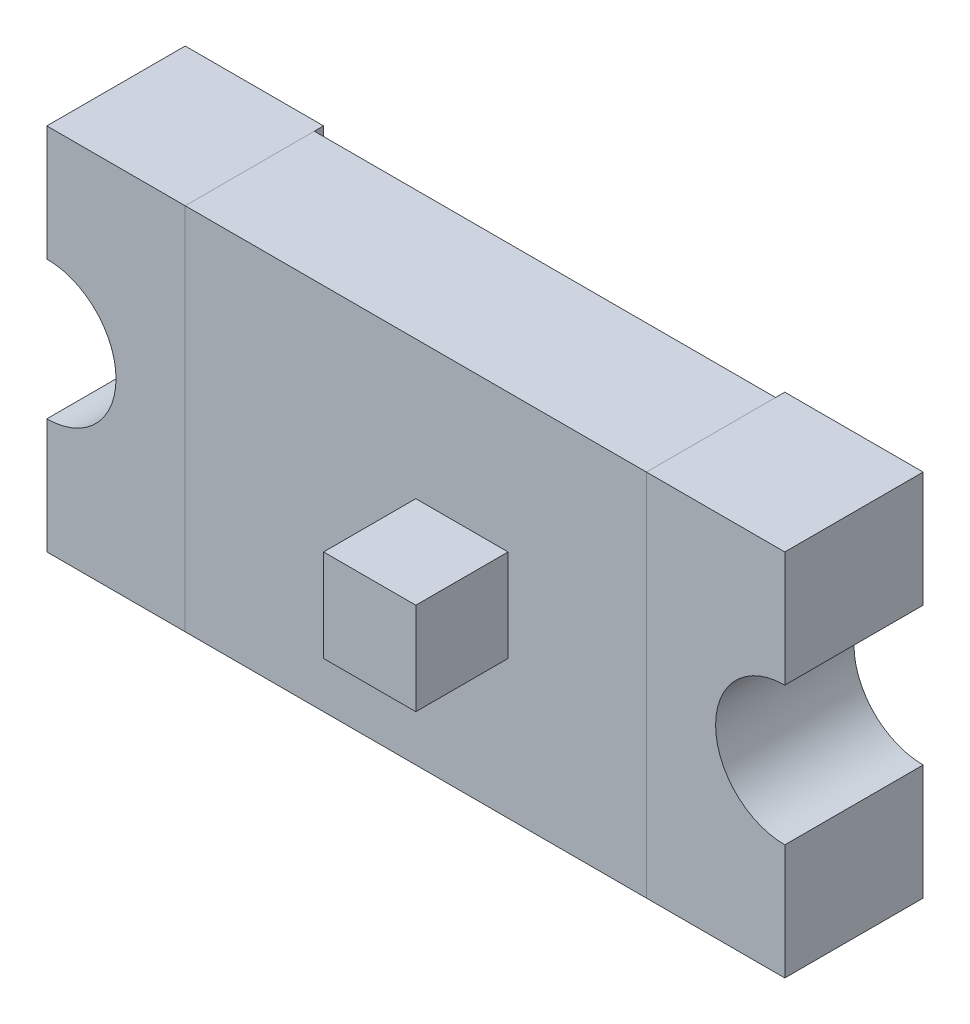
ISO-10303-21;
HEADER;
FILE_DESCRIPTION(('STEP AP214'),'2;1');
FILE_NAME('part.step','',(''),(''),'','','');
FILE_SCHEMA(('AUTOMOTIVE_DESIGN { 1 0 10303 214 1 1 1 1 }'));
ENDSEC;
DATA;
#1=APPLICATION_CONTEXT('core data for automotive mechanical design processes');
#2=APPLICATION_PROTOCOL_DEFINITION('international standard','automotive_design',2000,#1);
#3=PRODUCT_CONTEXT('',#1,'mechanical');
#4=PRODUCT('Part','Part','',(#3));
#5=PRODUCT_RELATED_PRODUCT_CATEGORY('part','',(#4));
#6=PRODUCT_DEFINITION_FORMATION('','',#4);
#7=PRODUCT_DEFINITION_CONTEXT('part definition',#1,'design');
#8=PRODUCT_DEFINITION('design','',#6,#7);
#9=PRODUCT_DEFINITION_SHAPE('','',#8);
#10=(LENGTH_UNIT() NAMED_UNIT(*) SI_UNIT(.MILLI.,.METRE.));
#11=(NAMED_UNIT(*) PLANE_ANGLE_UNIT() SI_UNIT($,.RADIAN.));
#12=(NAMED_UNIT(*) SI_UNIT($,.STERADIAN.) SOLID_ANGLE_UNIT());
#13=UNCERTAINTY_MEASURE_WITH_UNIT(LENGTH_MEASURE(1.E-05),#10,'distance_accuracy_value','');
#14=(GEOMETRIC_REPRESENTATION_CONTEXT(3) GLOBAL_UNCERTAINTY_ASSIGNED_CONTEXT((#13)) GLOBAL_UNIT_ASSIGNED_CONTEXT((#10,
#11,#12)) REPRESENTATION_CONTEXT('',''));
#15=CARTESIAN_POINT('',(0.,0.,0.));
#16=DIRECTION('',(0.,0.,1.));
#17=DIRECTION('',(1.,0.,0.));
#18=AXIS2_PLACEMENT_3D('',#15,#16,#17);
#19=CARTESIAN_POINT('',(0.5,-0.4,0.));
#20=DIRECTION('',(0.,0.,1.));
#21=DIRECTION('',(1.,0.,0.));
#22=AXIS2_PLACEMENT_3D('',#19,#20,#21);
#23=PLANE('',#22);
#24=DIRECTION('',(1.,0.,0.));
#25=VECTOR('',#24,1.);
#26=CARTESIAN_POINT('',(0.5,0.4,0.));
#27=LINE('',#26,#25);
#28=CARTESIAN_POINT('',(0.5,0.4,0.));
#29=VERTEX_POINT('',#28);
#30=CARTESIAN_POINT('',(0.8,0.4,0.));
#31=VERTEX_POINT('',#30);
#32=EDGE_CURVE('E252',#29,#31,#27,.T.);
#33=ORIENTED_EDGE('',*,*,#32,.T.);
#34=DIRECTION('',(0.,1.,0.));
#35=VECTOR('',#34,1.);
#36=CARTESIAN_POINT('',(0.8,-0.4,0.));
#37=LINE('',#36,#35);
#38=CARTESIAN_POINT('',(0.8,0.15,0.));
#39=VERTEX_POINT('',#38);
#40=EDGE_CURVE('E220',#39,#31,#37,.T.);
#41=ORIENTED_EDGE('',*,*,#40,.F.);
#42=CARTESIAN_POINT('',(0.8,0.,0.));
#43=DIRECTION('',(0.,0.,1.));
#44=DIRECTION('',(1.,0.,0.));
#45=AXIS2_PLACEMENT_3D('',#42,#43,#44);
#46=CIRCLE('',#45,0.15);
#47=CARTESIAN_POINT('',(0.8,-0.15,0.));
#48=VERTEX_POINT('',#47);
#49=EDGE_CURVE('E221',#39,#48,#46,.T.);
#50=ORIENTED_EDGE('',*,*,#49,.T.);
#51=DIRECTION('',(0.,1.,0.));
#52=VECTOR('',#51,1.);
#53=CARTESIAN_POINT('',(0.8,-0.4,0.));
#54=LINE('',#53,#52);
#55=CARTESIAN_POINT('',(0.8,-0.4,0.));
#56=VERTEX_POINT('',#55);
#57=EDGE_CURVE('E41',#56,#48,#54,.T.);
#58=ORIENTED_EDGE('',*,*,#57,.F.);
#59=DIRECTION('',(1.,0.,0.));
#60=VECTOR('',#59,1.);
#61=CARTESIAN_POINT('',(0.5,-0.4,0.));
#62=LINE('',#61,#60);
#63=CARTESIAN_POINT('',(0.5,-0.4,0.));
#64=VERTEX_POINT('',#63);
#65=EDGE_CURVE('E173',#64,#56,#62,.T.);
#66=ORIENTED_EDGE('',*,*,#65,.F.);
#67=DIRECTION('',(0.,1.,0.));
#68=VECTOR('',#67,1.);
#69=CARTESIAN_POINT('',(0.5,-0.4,0.));
#70=LINE('',#69,#68);
#71=EDGE_CURVE('E11',#64,#29,#70,.T.);
#72=ORIENTED_EDGE('',*,*,#71,.T.);
#73=EDGE_LOOP('',(#33,#41,#50,#58,#66,#72));
#74=FACE_BOUND('',#73,.T.);
#75=ADVANCED_FACE('F16',(#74),#23,.F.);
#76=CARTESIAN_POINT('',(0.5,-0.4,0.));
#77=DIRECTION('',(1.,0.,0.));
#78=DIRECTION('',(0.,1.,0.));
#79=AXIS2_PLACEMENT_3D('',#76,#77,#78);
#80=PLANE('',#79);
#81=DIRECTION('',(0.,0.,1.));
#82=VECTOR('',#81,1.);
#83=CARTESIAN_POINT('',(0.5,-0.4,0.));
#84=LINE('',#83,#82);
#85=CARTESIAN_POINT('',(0.5,-0.4,0.02));
#86=VERTEX_POINT('',#85);
#87=EDGE_CURVE('E175',#64,#86,#84,.T.);
#88=ORIENTED_EDGE('',*,*,#87,.T.);
#89=DIRECTION('',(0.,1.,0.));
#90=VECTOR('',#89,1.);
#91=CARTESIAN_POINT('',(0.5,-0.4,0.02));
#92=LINE('',#91,#90);
#93=CARTESIAN_POINT('',(0.5,0.4,0.02));
#94=VERTEX_POINT('',#93);
#95=EDGE_CURVE('E238',#86,#94,#92,.T.);
#96=ORIENTED_EDGE('',*,*,#95,.T.);
#97=DIRECTION('',(0.,0.,1.));
#98=VECTOR('',#97,1.);
#99=CARTESIAN_POINT('',(0.5,0.4,0.));
#100=LINE('',#99,#98);
#101=EDGE_CURVE('E256',#29,#94,#100,.T.);
#102=ORIENTED_EDGE('',*,*,#101,.F.);
#103=ORIENTED_EDGE('',*,*,#71,.F.);
#104=EDGE_LOOP('',(#88,#96,#102,#103));
#105=FACE_BOUND('',#104,.T.);
#106=ADVANCED_FACE('F420',(#105),#80,.F.);
#107=CARTESIAN_POINT('',(-0.5,0.4,0.));
#108=DIRECTION('',(-1.,0.,0.));
#109=DIRECTION('',(0.,0.,1.));
#110=AXIS2_PLACEMENT_3D('',#107,#108,#109);
#111=PLANE('',#110);
#112=DIRECTION('',(0.,0.,1.));
#113=VECTOR('',#112,1.);
#114=CARTESIAN_POINT('',(-0.5,0.4,0.));
#115=LINE('',#114,#113);
#116=CARTESIAN_POINT('',(-0.5,0.4,0.));
#117=VERTEX_POINT('',#116);
#118=CARTESIAN_POINT('',(-0.5,0.4,0.02));
#119=VERTEX_POINT('',#118);
#120=EDGE_CURVE('E210',#117,#119,#115,.T.);
#121=ORIENTED_EDGE('',*,*,#120,.T.);
#122=DIRECTION('',(0.,1.,0.));
#123=VECTOR('',#122,1.);
#124=CARTESIAN_POINT('',(-0.5,-0.4,0.02));
#125=LINE('',#124,#123);
#126=CARTESIAN_POINT('',(-0.5,-0.4,0.02));
#127=VERTEX_POINT('',#126);
#128=EDGE_CURVE('E216',#127,#119,#125,.T.);
#129=ORIENTED_EDGE('',*,*,#128,.F.);
#130=DIRECTION('',(0.,0.,1.));
#131=VECTOR('',#130,1.);
#132=CARTESIAN_POINT('',(-0.5,-0.4,0.));
#133=LINE('',#132,#131);
#134=CARTESIAN_POINT('',(-0.5,-0.4,0.));
#135=VERTEX_POINT('',#134);
#136=EDGE_CURVE('E328',#135,#127,#133,.T.);
#137=ORIENTED_EDGE('',*,*,#136,.F.);
#138=DIRECTION('',(0.,-1.,0.));
#139=VECTOR('',#138,1.);
#140=CARTESIAN_POINT('',(-0.5,0.4,0.));
#141=LINE('',#140,#139);
#142=EDGE_CURVE('E27',#117,#135,#141,.T.);
#143=ORIENTED_EDGE('',*,*,#142,.F.);
#144=EDGE_LOOP('',(#121,#129,#137,#143));
#145=FACE_BOUND('',#144,.T.);
#146=ADVANCED_FACE('F608',(#145),#111,.F.);
#147=CARTESIAN_POINT('',(-0.5,0.4,0.));
#148=DIRECTION('',(0.,0.,1.));
#149=DIRECTION('',(1.,0.,0.));
#150=AXIS2_PLACEMENT_3D('',#147,#148,#149);
#151=PLANE('',#150);
#152=DIRECTION('',(-1.,0.,0.));
#153=VECTOR('',#152,1.);
#154=CARTESIAN_POINT('',(-0.5,-0.4,0.));
#155=LINE('',#154,#153);
#156=CARTESIAN_POINT('',(-0.8,-0.4,0.));
#157=VERTEX_POINT('',#156);
#158=EDGE_CURVE('E332',#135,#157,#155,.T.);
#159=ORIENTED_EDGE('',*,*,#158,.T.);
#160=DIRECTION('',(0.,-1.,0.));
#161=VECTOR('',#160,1.);
#162=CARTESIAN_POINT('',(-0.8,0.4,0.));
#163=LINE('',#162,#161);
#164=CARTESIAN_POINT('',(-0.8,-0.15,0.));
#165=VERTEX_POINT('',#164);
#166=EDGE_CURVE('E294',#165,#157,#163,.T.);
#167=ORIENTED_EDGE('',*,*,#166,.F.);
#168=CARTESIAN_POINT('',(-0.8,0.,0.));
#169=DIRECTION('',(0.,0.,1.));
#170=DIRECTION('',(-1.,0.,0.));
#171=AXIS2_PLACEMENT_3D('',#168,#169,#170);
#172=CIRCLE('',#171,0.15);
#173=CARTESIAN_POINT('',(-0.8,0.15,0.));
#174=VERTEX_POINT('',#173);
#175=EDGE_CURVE('E76',#165,#174,#172,.T.);
#176=ORIENTED_EDGE('',*,*,#175,.T.);
#177=DIRECTION('',(0.,-1.,0.));
#178=VECTOR('',#177,1.);
#179=CARTESIAN_POINT('',(-0.8,0.4,0.));
#180=LINE('',#179,#178);
#181=CARTESIAN_POINT('',(-0.8,0.4,0.));
#182=VERTEX_POINT('',#181);
#183=EDGE_CURVE('E212',#182,#174,#180,.T.);
#184=ORIENTED_EDGE('',*,*,#183,.F.);
#185=DIRECTION('',(-1.,0.,0.));
#186=VECTOR('',#185,1.);
#187=CARTESIAN_POINT('',(-0.5,0.4,0.));
#188=LINE('',#187,#186);
#189=EDGE_CURVE('E211',#117,#182,#188,.T.);
#190=ORIENTED_EDGE('',*,*,#189,.F.);
#191=ORIENTED_EDGE('',*,*,#142,.T.);
#192=EDGE_LOOP('',(#159,#167,#176,#184,#190,#191));
#193=FACE_BOUND('',#192,.T.);
#194=ADVANCED_FACE('F604',(#193),#151,.F.);
#195=CARTESIAN_POINT('',(0.8,-0.4,0.));
#196=DIRECTION('',(1.,0.,0.));
#197=DIRECTION('',(0.,1.,0.));
#198=AXIS2_PLACEMENT_3D('',#195,#196,#197);
#199=PLANE('',#198);
#200=DIRECTION('',(0.,1.,0.));
#201=VECTOR('',#200,1.);
#202=CARTESIAN_POINT('',(0.8,-0.4,0.3));
#203=LINE('',#202,#201);
#204=CARTESIAN_POINT('',(0.8,-0.4,0.3));
#205=VERTEX_POINT('',#204);
#206=CARTESIAN_POINT('',(0.8,-0.15,0.3));
#207=VERTEX_POINT('',#206);
#208=EDGE_CURVE('E178',#205,#207,#203,.T.);
#209=ORIENTED_EDGE('',*,*,#208,.F.);
#210=DIRECTION('',(0.,0.,1.));
#211=VECTOR('',#210,1.);
#212=CARTESIAN_POINT('',(0.8,-0.4,0.));
#213=LINE('',#212,#211);
#214=EDGE_CURVE('E164',#56,#205,#213,.T.);
#215=ORIENTED_EDGE('',*,*,#214,.F.);
#216=ORIENTED_EDGE('',*,*,#57,.T.);
#217=DIRECTION('',(0.,0.,1.));
#218=VECTOR('',#217,1.);
#219=CARTESIAN_POINT('',(0.8,-0.15,0.));
#220=LINE('',#219,#218);
#221=EDGE_CURVE('E181',#48,#207,#220,.T.);
#222=ORIENTED_EDGE('',*,*,#221,.T.);
#223=EDGE_LOOP('',(#209,#215,#216,#222));
#224=FACE_BOUND('',#223,.T.);
#225=ADVANCED_FACE('F179',(#224),#199,.T.);
#226=CARTESIAN_POINT('',(0.8,0.,0.));
#227=DIRECTION('',(0.,0.,1.));
#228=DIRECTION('',(-1.,0.,0.));
#229=AXIS2_PLACEMENT_3D('',#226,#227,#228);
#230=CYLINDRICAL_SURFACE('',#229,0.15);
#231=DIRECTION('',(0.,0.,1.));
#232=VECTOR('',#231,1.);
#233=CARTESIAN_POINT('',(0.8,0.15,0.));
#234=LINE('',#233,#232);
#235=CARTESIAN_POINT('',(0.8,0.15,0.3));
#236=VERTEX_POINT('',#235);
#237=EDGE_CURVE('E217',#39,#236,#234,.T.);
#238=ORIENTED_EDGE('',*,*,#237,.T.);
#239=CARTESIAN_POINT('',(0.8,0.,0.3));
#240=DIRECTION('',(0.,0.,1.));
#241=DIRECTION('',(1.,0.,0.));
#242=AXIS2_PLACEMENT_3D('',#239,#240,#241);
#243=CIRCLE('',#242,0.15);
#244=EDGE_CURVE('E186',#236,#207,#243,.T.);
#245=ORIENTED_EDGE('',*,*,#244,.T.);
#246=ORIENTED_EDGE('',*,*,#221,.F.);
#247=ORIENTED_EDGE('',*,*,#49,.F.);
#248=EDGE_LOOP('',(#238,#245,#246,#247));
#249=FACE_BOUND('',#248,.T.);
#250=ADVANCED_FACE('F641',(#249),#230,.F.);
#251=CARTESIAN_POINT('',(0.8,-0.4,0.));
#252=DIRECTION('',(1.,0.,0.));
#253=DIRECTION('',(0.,1.,0.));
#254=AXIS2_PLACEMENT_3D('',#251,#252,#253);
#255=PLANE('',#254);
#256=DIRECTION('',(0.,1.,0.));
#257=VECTOR('',#256,1.);
#258=CARTESIAN_POINT('',(0.8,-0.4,0.3));
#259=LINE('',#258,#257);
#260=CARTESIAN_POINT('',(0.8,0.4,0.3));
#261=VERTEX_POINT('',#260);
#262=EDGE_CURVE('E346',#236,#261,#259,.T.);
#263=ORIENTED_EDGE('',*,*,#262,.F.);
#264=ORIENTED_EDGE('',*,*,#237,.F.);
#265=ORIENTED_EDGE('',*,*,#40,.T.);
#266=DIRECTION('',(0.,0.,1.));
#267=VECTOR('',#266,1.);
#268=CARTESIAN_POINT('',(0.8,0.4,0.));
#269=LINE('',#268,#267);
#270=EDGE_CURVE('E20',#31,#261,#269,.T.);
#271=ORIENTED_EDGE('',*,*,#270,.T.);
#272=EDGE_LOOP('',(#263,#264,#265,#271));
#273=FACE_BOUND('',#272,.T.);
#274=ADVANCED_FACE('F637',(#273),#255,.T.);
#275=CARTESIAN_POINT('',(0.5,0.4,0.));
#276=DIRECTION('',(0.,1.,0.));
#277=DIRECTION('',(1.,0.,0.));
#278=AXIS2_PLACEMENT_3D('',#275,#276,#277);
#279=PLANE('',#278);
#280=ORIENTED_EDGE('',*,*,#32,.F.);
#281=ORIENTED_EDGE('',*,*,#101,.T.);
#282=DIRECTION('',(0.,0.,1.));
#283=VECTOR('',#282,1.);
#284=CARTESIAN_POINT('',(0.5,0.4,0.02));
#285=LINE('',#284,#283);
#286=CARTESIAN_POINT('',(0.5,0.4,0.3));
#287=VERTEX_POINT('',#286);
#288=EDGE_CURVE('E201',#94,#287,#285,.T.);
#289=ORIENTED_EDGE('',*,*,#288,.T.);
#290=DIRECTION('',(1.,0.,0.));
#291=VECTOR('',#290,1.);
#292=CARTESIAN_POINT('',(0.5,0.4,0.3));
#293=LINE('',#292,#291);
#294=EDGE_CURVE('E194',#287,#261,#293,.T.);
#295=ORIENTED_EDGE('',*,*,#294,.T.);
#296=ORIENTED_EDGE('',*,*,#270,.F.);
#297=EDGE_LOOP('',(#280,#281,#289,#295,#296));
#298=FACE_BOUND('',#297,.T.);
#299=ADVANCED_FACE('F424',(#298),#279,.T.);
#300=CARTESIAN_POINT('',(0.5,-0.4,0.));
#301=DIRECTION('',(0.,1.,0.));
#302=DIRECTION('',(1.,0.,0.));
#303=AXIS2_PLACEMENT_3D('',#300,#301,#302);
#304=PLANE('',#303);
#305=ORIENTED_EDGE('',*,*,#65,.T.);
#306=ORIENTED_EDGE('',*,*,#214,.T.);
#307=DIRECTION('',(1.,0.,0.));
#308=VECTOR('',#307,1.);
#309=CARTESIAN_POINT('',(0.5,-0.4,0.3));
#310=LINE('',#309,#308);
#311=CARTESIAN_POINT('',(0.5,-0.4,0.3));
#312=VERTEX_POINT('',#311);
#313=EDGE_CURVE('E169',#312,#205,#310,.T.);
#314=ORIENTED_EDGE('',*,*,#313,.F.);
#315=DIRECTION('',(0.,0.,1.));
#316=VECTOR('',#315,1.);
#317=CARTESIAN_POINT('',(0.5,-0.4,0.02));
#318=LINE('',#317,#316);
#319=EDGE_CURVE('E234',#86,#312,#318,.T.);
#320=ORIENTED_EDGE('',*,*,#319,.F.);
#321=ORIENTED_EDGE('',*,*,#87,.F.);
#322=EDGE_LOOP('',(#305,#306,#314,#320,#321));
#323=FACE_BOUND('',#322,.T.);
#324=ADVANCED_FACE('F166',(#323),#304,.F.);
#325=CARTESIAN_POINT('',(-0.5,-0.4,0.02));
#326=DIRECTION('',(0.,0.,1.));
#327=DIRECTION('',(1.,0.,0.));
#328=AXIS2_PLACEMENT_3D('',#325,#326,#327);
#329=PLANE('',#328);
#330=ORIENTED_EDGE('',*,*,#128,.T.);
#331=DIRECTION('',(1.,0.,0.));
#332=VECTOR('',#331,1.);
#333=CARTESIAN_POINT('',(-0.5,0.4,0.02));
#334=LINE('',#333,#332);
#335=EDGE_CURVE('E263',#119,#94,#334,.T.);
#336=ORIENTED_EDGE('',*,*,#335,.T.);
#337=ORIENTED_EDGE('',*,*,#95,.F.);
#338=DIRECTION('',(1.,0.,0.));
#339=VECTOR('',#338,1.);
#340=CARTESIAN_POINT('',(-0.5,-0.4,0.02));
#341=LINE('',#340,#339);
#342=EDGE_CURVE('E228',#127,#86,#341,.T.);
#343=ORIENTED_EDGE('',*,*,#342,.F.);
#344=EDGE_LOOP('',(#330,#336,#337,#343));
#345=FACE_BOUND('',#344,.T.);
#346=ADVANCED_FACE('F735',(#345),#329,.F.);
#347=CARTESIAN_POINT('',(-0.8,0.4,0.));
#348=DIRECTION('',(-1.,0.,0.));
#349=DIRECTION('',(0.,0.,1.));
#350=AXIS2_PLACEMENT_3D('',#347,#348,#349);
#351=PLANE('',#350);
#352=DIRECTION('',(0.,-1.,0.));
#353=VECTOR('',#352,1.);
#354=CARTESIAN_POINT('',(-0.8,0.4,0.3));
#355=LINE('',#354,#353);
#356=CARTESIAN_POINT('',(-0.8,0.4,0.3));
#357=VERTEX_POINT('',#356);
#358=CARTESIAN_POINT('',(-0.8,0.15,0.3));
#359=VERTEX_POINT('',#358);
#360=EDGE_CURVE('E245',#357,#359,#355,.T.);
#361=ORIENTED_EDGE('',*,*,#360,.F.);
#362=DIRECTION('',(0.,0.,1.));
#363=VECTOR('',#362,1.);
#364=CARTESIAN_POINT('',(-0.8,0.4,0.));
#365=LINE('',#364,#363);
#366=EDGE_CURVE('E207',#182,#357,#365,.T.);
#367=ORIENTED_EDGE('',*,*,#366,.F.);
#368=ORIENTED_EDGE('',*,*,#183,.T.);
#369=DIRECTION('',(0.,0.,1.));
#370=VECTOR('',#369,1.);
#371=CARTESIAN_POINT('',(-0.8,0.15,0.));
#372=LINE('',#371,#370);
#373=EDGE_CURVE('E257',#174,#359,#372,.T.);
#374=ORIENTED_EDGE('',*,*,#373,.T.);
#375=EDGE_LOOP('',(#361,#367,#368,#374));
#376=FACE_BOUND('',#375,.T.);
#377=ADVANCED_FACE('F751',(#376),#351,.T.);
#378=CARTESIAN_POINT('',(-0.8,0.,0.));
#379=DIRECTION('',(0.,0.,1.));
#380=DIRECTION('',(1.,0.,0.));
#381=AXIS2_PLACEMENT_3D('',#378,#379,#380);
#382=CYLINDRICAL_SURFACE('',#381,0.15);
#383=DIRECTION('',(0.,0.,1.));
#384=VECTOR('',#383,1.);
#385=CARTESIAN_POINT('',(-0.8,-0.15,0.));
#386=LINE('',#385,#384);
#387=CARTESIAN_POINT('',(-0.8,-0.15,0.3));
#388=VERTEX_POINT('',#387);
#389=EDGE_CURVE('E308',#165,#388,#386,.T.);
#390=ORIENTED_EDGE('',*,*,#389,.T.);
#391=CARTESIAN_POINT('',(-0.8,0.,0.3));
#392=DIRECTION('',(0.,0.,1.));
#393=DIRECTION('',(-1.,0.,0.));
#394=AXIS2_PLACEMENT_3D('',#391,#392,#393);
#395=CIRCLE('',#394,0.15);
#396=EDGE_CURVE('E229',#388,#359,#395,.T.);
#397=ORIENTED_EDGE('',*,*,#396,.T.);
#398=ORIENTED_EDGE('',*,*,#373,.F.);
#399=ORIENTED_EDGE('',*,*,#175,.F.);
#400=EDGE_LOOP('',(#390,#397,#398,#399));
#401=FACE_BOUND('',#400,.T.);
#402=ADVANCED_FACE('F624',(#401),#382,.F.);
#403=CARTESIAN_POINT('',(-0.5,0.4,0.));
#404=DIRECTION('',(0.,-1.,0.));
#405=DIRECTION('',(0.,0.,-1.));
#406=AXIS2_PLACEMENT_3D('',#403,#404,#405);
#407=PLANE('',#406);
#408=ORIENTED_EDGE('',*,*,#189,.T.);
#409=ORIENTED_EDGE('',*,*,#366,.T.);
#410=DIRECTION('',(-1.,0.,0.));
#411=VECTOR('',#410,1.);
#412=CARTESIAN_POINT('',(-0.5,0.4,0.3));
#413=LINE('',#412,#411);
#414=CARTESIAN_POINT('',(-0.5,0.4,0.3));
#415=VERTEX_POINT('',#414);
#416=EDGE_CURVE('E324',#415,#357,#413,.T.);
#417=ORIENTED_EDGE('',*,*,#416,.F.);
#418=DIRECTION('',(0.,0.,1.));
#419=VECTOR('',#418,1.);
#420=CARTESIAN_POINT('',(-0.5,0.4,0.02));
#421=LINE('',#420,#419);
#422=EDGE_CURVE('E260',#119,#415,#421,.T.);
#423=ORIENTED_EDGE('',*,*,#422,.F.);
#424=ORIENTED_EDGE('',*,*,#120,.F.);
#425=EDGE_LOOP('',(#408,#409,#417,#423,#424));
#426=FACE_BOUND('',#425,.T.);
#427=ADVANCED_FACE('F620',(#426),#407,.F.);
#428=CARTESIAN_POINT('',(-0.8,0.4,0.));
#429=DIRECTION('',(-1.,0.,0.));
#430=DIRECTION('',(0.,0.,1.));
#431=AXIS2_PLACEMENT_3D('',#428,#429,#430);
#432=PLANE('',#431);
#433=DIRECTION('',(0.,-1.,0.));
#434=VECTOR('',#433,1.);
#435=CARTESIAN_POINT('',(-0.8,0.4,0.3));
#436=LINE('',#435,#434);
#437=CARTESIAN_POINT('',(-0.8,-0.4,0.3));
#438=VERTEX_POINT('',#437);
#439=EDGE_CURVE('E224',#388,#438,#436,.T.);
#440=ORIENTED_EDGE('',*,*,#439,.F.);
#441=ORIENTED_EDGE('',*,*,#389,.F.);
#442=ORIENTED_EDGE('',*,*,#166,.T.);
#443=DIRECTION('',(0.,0.,1.));
#444=VECTOR('',#443,1.);
#445=CARTESIAN_POINT('',(-0.8,-0.4,0.));
#446=LINE('',#445,#444);
#447=EDGE_CURVE('E311',#157,#438,#446,.T.);
#448=ORIENTED_EDGE('',*,*,#447,.T.);
#449=EDGE_LOOP('',(#440,#441,#442,#448));
#450=FACE_BOUND('',#449,.T.);
#451=ADVANCED_FACE('F598',(#450),#432,.T.);
#452=CARTESIAN_POINT('',(-0.5,-0.4,0.));
#453=DIRECTION('',(0.,-1.,0.));
#454=DIRECTION('',(0.,0.,-1.));
#455=AXIS2_PLACEMENT_3D('',#452,#453,#454);
#456=PLANE('',#455);
#457=ORIENTED_EDGE('',*,*,#158,.F.);
#458=ORIENTED_EDGE('',*,*,#136,.T.);
#459=DIRECTION('',(0.,0.,1.));
#460=VECTOR('',#459,1.);
#461=CARTESIAN_POINT('',(-0.5,-0.4,0.02));
#462=LINE('',#461,#460);
#463=CARTESIAN_POINT('',(-0.5,-0.4,0.3));
#464=VERTEX_POINT('',#463);
#465=EDGE_CURVE('E237',#127,#464,#462,.T.);
#466=ORIENTED_EDGE('',*,*,#465,.T.);
#467=DIRECTION('',(-1.,0.,0.));
#468=VECTOR('',#467,1.);
#469=CARTESIAN_POINT('',(-0.5,-0.4,0.3));
#470=LINE('',#469,#468);
#471=EDGE_CURVE('E282',#464,#438,#470,.T.);
#472=ORIENTED_EDGE('',*,*,#471,.T.);
#473=ORIENTED_EDGE('',*,*,#447,.F.);
#474=EDGE_LOOP('',(#457,#458,#466,#472,#473));
#475=FACE_BOUND('',#474,.T.);
#476=ADVANCED_FACE('F18',(#475),#456,.T.);
#477=CARTESIAN_POINT('',(0.5,-0.4,0.3));
#478=DIRECTION('',(0.,0.,1.));
#479=DIRECTION('',(1.,0.,0.));
#480=AXIS2_PLACEMENT_3D('',#477,#478,#479);
#481=PLANE('',#480);
#482=ORIENTED_EDGE('',*,*,#294,.F.);
#483=DIRECTION('',(0.,1.,0.));
#484=VECTOR('',#483,1.);
#485=CARTESIAN_POINT('',(0.5,-0.4,0.3));
#486=LINE('',#485,#484);
#487=EDGE_CURVE('E191',#312,#287,#486,.T.);
#488=ORIENTED_EDGE('',*,*,#487,.F.);
#489=ORIENTED_EDGE('',*,*,#313,.T.);
#490=ORIENTED_EDGE('',*,*,#208,.T.);
#491=ORIENTED_EDGE('',*,*,#244,.F.);
#492=ORIENTED_EDGE('',*,*,#262,.T.);
#493=EDGE_LOOP('',(#482,#488,#489,#490,#491,#492));
#494=FACE_BOUND('',#493,.T.);
#495=ADVANCED_FACE('F189',(#494),#481,.T.);
#496=CARTESIAN_POINT('',(-0.5,0.4,0.02));
#497=DIRECTION('',(0.,1.,0.));
#498=DIRECTION('',(1.,0.,0.));
#499=AXIS2_PLACEMENT_3D('',#496,#497,#498);
#500=PLANE('',#499);
#501=ORIENTED_EDGE('',*,*,#335,.F.);
#502=ORIENTED_EDGE('',*,*,#422,.T.);
#503=DIRECTION('',(1.,0.,0.));
#504=VECTOR('',#503,1.);
#505=CARTESIAN_POINT('',(-0.5,0.4,0.3));
#506=LINE('',#505,#504);
#507=EDGE_CURVE('E248',#415,#287,#506,.T.);
#508=ORIENTED_EDGE('',*,*,#507,.T.);
#509=ORIENTED_EDGE('',*,*,#288,.F.);
#510=EDGE_LOOP('',(#501,#502,#508,#509));
#511=FACE_BOUND('',#510,.T.);
#512=ADVANCED_FACE('F674',(#511),#500,.T.);
#513=CARTESIAN_POINT('',(-0.5,-0.4,0.02));
#514=DIRECTION('',(0.,1.,0.));
#515=DIRECTION('',(1.,0.,0.));
#516=AXIS2_PLACEMENT_3D('',#513,#514,#515);
#517=PLANE('',#516);
#518=ORIENTED_EDGE('',*,*,#342,.T.);
#519=ORIENTED_EDGE('',*,*,#319,.T.);
#520=DIRECTION('',(1.,0.,0.));
#521=VECTOR('',#520,1.);
#522=CARTESIAN_POINT('',(-0.5,-0.4,0.3));
#523=LINE('',#522,#521);
#524=EDGE_CURVE('E230',#464,#312,#523,.T.);
#525=ORIENTED_EDGE('',*,*,#524,.F.);
#526=ORIENTED_EDGE('',*,*,#465,.F.);
#527=EDGE_LOOP('',(#518,#519,#525,#526));
#528=FACE_BOUND('',#527,.T.);
#529=ADVANCED_FACE('F650',(#528),#517,.F.);
#530=CARTESIAN_POINT('',(-0.5,0.4,0.3));
#531=DIRECTION('',(0.,0.,1.));
#532=DIRECTION('',(1.,0.,0.));
#533=AXIS2_PLACEMENT_3D('',#530,#531,#532);
#534=PLANE('',#533);
#535=ORIENTED_EDGE('',*,*,#471,.F.);
#536=DIRECTION('',(0.,1.,0.));
#537=VECTOR('',#536,1.);
#538=CARTESIAN_POINT('',(-0.5,-0.4,0.3));
#539=LINE('',#538,#537);
#540=EDGE_CURVE('E233',#464,#415,#539,.T.);
#541=ORIENTED_EDGE('',*,*,#540,.T.);
#542=ORIENTED_EDGE('',*,*,#416,.T.);
#543=ORIENTED_EDGE('',*,*,#360,.T.);
#544=ORIENTED_EDGE('',*,*,#396,.F.);
#545=ORIENTED_EDGE('',*,*,#439,.T.);
#546=EDGE_LOOP('',(#535,#541,#542,#543,#544,#545));
#547=FACE_BOUND('',#546,.T.);
#548=ADVANCED_FACE('F646',(#547),#534,.T.);
#549=CARTESIAN_POINT('',(-0.5,-0.4,0.3));
#550=DIRECTION('',(0.,0.,1.));
#551=DIRECTION('',(1.,0.,0.));
#552=AXIS2_PLACEMENT_3D('',#549,#550,#551);
#553=PLANE('',#552);
#554=DIRECTION('',(1.,0.,0.));
#555=VECTOR('',#554,1.);
#556=CARTESIAN_POINT('',(0.,0.1,0.3));
#557=LINE('',#556,#555);
#558=CARTESIAN_POINT('',(0.,0.1,0.3));
#559=VERTEX_POINT('',#558);
#560=CARTESIAN_POINT('',(0.2,0.1,0.3));
#561=VERTEX_POINT('',#560);
#562=EDGE_CURVE('E290',#559,#561,#557,.T.);
#563=ORIENTED_EDGE('',*,*,#562,.T.);
#564=DIRECTION('',(0.,1.,0.));
#565=VECTOR('',#564,1.);
#566=CARTESIAN_POINT('',(0.2,-0.1,0.3));
#567=LINE('',#566,#565);
#568=CARTESIAN_POINT('',(0.2,-0.1,0.3));
#569=VERTEX_POINT('',#568);
#570=EDGE_CURVE('E314',#569,#561,#567,.T.);
#571=ORIENTED_EDGE('',*,*,#570,.F.);
#572=DIRECTION('',(1.,0.,0.));
#573=VECTOR('',#572,1.);
#574=CARTESIAN_POINT('',(0.,-0.1,0.3));
#575=LINE('',#574,#573);
#576=CARTESIAN_POINT('',(0.,-0.1,0.3));
#577=VERTEX_POINT('',#576);
#578=EDGE_CURVE('E307',#577,#569,#575,.T.);
#579=ORIENTED_EDGE('',*,*,#578,.F.);
#580=DIRECTION('',(0.,1.,0.));
#581=VECTOR('',#580,1.);
#582=CARTESIAN_POINT('',(0.,-0.1,0.3));
#583=LINE('',#582,#581);
#584=EDGE_CURVE('E286',#577,#559,#583,.T.);
#585=ORIENTED_EDGE('',*,*,#584,.T.);
#586=EDGE_LOOP('',(#563,#571,#579,#585));
#587=FACE_BOUND('',#586,.T.);
#588=ORIENTED_EDGE('',*,*,#540,.F.);
#589=ORIENTED_EDGE('',*,*,#524,.T.);
#590=ORIENTED_EDGE('',*,*,#487,.T.);
#591=ORIENTED_EDGE('',*,*,#507,.F.);
#592=EDGE_LOOP('',(#588,#589,#590,#591));
#593=FACE_BOUND('',#592,.T.);
#594=ADVANCED_FACE('F398',(#587,#593),#553,.T.);
#595=CARTESIAN_POINT('',(0.,-0.1,0.3));
#596=DIRECTION('',(0.,1.,0.));
#597=DIRECTION('',(1.,0.,0.));
#598=AXIS2_PLACEMENT_3D('',#595,#596,#597);
#599=PLANE('',#598);
#600=ORIENTED_EDGE('',*,*,#578,.T.);
#601=DIRECTION('',(0.,0.,1.));
#602=VECTOR('',#601,1.);
#603=CARTESIAN_POINT('',(0.2,-0.1,0.3));
#604=LINE('',#603,#602);
#605=CARTESIAN_POINT('',(0.2,-0.1,0.5));
#606=VERTEX_POINT('',#605);
#607=EDGE_CURVE('E318',#569,#606,#604,.T.);
#608=ORIENTED_EDGE('',*,*,#607,.T.);
#609=DIRECTION('',(1.,0.,0.));
#610=VECTOR('',#609,1.);
#611=CARTESIAN_POINT('',(0.,-0.1,0.5));
#612=LINE('',#611,#610);
#613=CARTESIAN_POINT('',(0.,-0.1,0.5));
#614=VERTEX_POINT('',#613);
#615=EDGE_CURVE('E268',#614,#606,#612,.T.);
#616=ORIENTED_EDGE('',*,*,#615,.F.);
#617=DIRECTION('',(0.,0.,1.));
#618=VECTOR('',#617,1.);
#619=CARTESIAN_POINT('',(0.,-0.1,0.3));
#620=LINE('',#619,#618);
#621=EDGE_CURVE('E343',#577,#614,#620,.T.);
#622=ORIENTED_EDGE('',*,*,#621,.F.);
#623=EDGE_LOOP('',(#600,#608,#616,#622));
#624=FACE_BOUND('',#623,.T.);
#625=ADVANCED_FACE('F659',(#624),#599,.F.);
#626=CARTESIAN_POINT('',(0.2,-0.1,0.3));
#627=DIRECTION('',(1.,0.,0.));
#628=DIRECTION('',(0.,1.,0.));
#629=AXIS2_PLACEMENT_3D('',#626,#627,#628);
#630=PLANE('',#629);
#631=ORIENTED_EDGE('',*,*,#607,.F.);
#632=ORIENTED_EDGE('',*,*,#570,.T.);
#633=DIRECTION('',(0.,0.,1.));
#634=VECTOR('',#633,1.);
#635=CARTESIAN_POINT('',(0.2,0.1,0.3));
#636=LINE('',#635,#634);
#637=CARTESIAN_POINT('',(0.2,0.1,0.5));
#638=VERTEX_POINT('',#637);
#639=EDGE_CURVE('E301',#561,#638,#636,.T.);
#640=ORIENTED_EDGE('',*,*,#639,.T.);
#641=DIRECTION('',(0.,1.,0.));
#642=VECTOR('',#641,1.);
#643=CARTESIAN_POINT('',(0.2,-0.1,0.5));
#644=LINE('',#643,#642);
#645=EDGE_CURVE('E272',#606,#638,#644,.T.);
#646=ORIENTED_EDGE('',*,*,#645,.F.);
#647=EDGE_LOOP('',(#631,#632,#640,#646));
#648=FACE_BOUND('',#647,.T.);
#649=ADVANCED_FACE('F391',(#648),#630,.T.);
#650=CARTESIAN_POINT('',(0.,0.1,0.3));
#651=DIRECTION('',(0.,1.,0.));
#652=DIRECTION('',(1.,0.,0.));
#653=AXIS2_PLACEMENT_3D('',#650,#651,#652);
#654=PLANE('',#653);
#655=ORIENTED_EDGE('',*,*,#562,.F.);
#656=DIRECTION('',(0.,0.,1.));
#657=VECTOR('',#656,1.);
#658=CARTESIAN_POINT('',(0.,0.1,0.3));
#659=LINE('',#658,#657);
#660=CARTESIAN_POINT('',(0.,0.1,0.5));
#661=VERTEX_POINT('',#660);
#662=EDGE_CURVE('E291',#559,#661,#659,.T.);
#663=ORIENTED_EDGE('',*,*,#662,.T.);
#664=DIRECTION('',(1.,0.,0.));
#665=VECTOR('',#664,1.);
#666=CARTESIAN_POINT('',(0.,0.1,0.5));
#667=LINE('',#666,#665);
#668=EDGE_CURVE('E336',#661,#638,#667,.T.);
#669=ORIENTED_EDGE('',*,*,#668,.T.);
#670=ORIENTED_EDGE('',*,*,#639,.F.);
#671=EDGE_LOOP('',(#655,#663,#669,#670));
#672=FACE_BOUND('',#671,.T.);
#673=ADVANCED_FACE('F380',(#672),#654,.T.);
#674=CARTESIAN_POINT('',(0.,-0.1,0.3));
#675=DIRECTION('',(1.,0.,0.));
#676=DIRECTION('',(0.,1.,0.));
#677=AXIS2_PLACEMENT_3D('',#674,#675,#676);
#678=PLANE('',#677);
#679=ORIENTED_EDGE('',*,*,#621,.T.);
#680=DIRECTION('',(0.,1.,0.));
#681=VECTOR('',#680,1.);
#682=CARTESIAN_POINT('',(0.,-0.1,0.5));
#683=LINE('',#682,#681);
#684=EDGE_CURVE('E204',#614,#661,#683,.T.);
#685=ORIENTED_EDGE('',*,*,#684,.T.);
#686=ORIENTED_EDGE('',*,*,#662,.F.);
#687=ORIENTED_EDGE('',*,*,#584,.F.);
#688=EDGE_LOOP('',(#679,#685,#686,#687));
#689=FACE_BOUND('',#688,.T.);
#690=ADVANCED_FACE('F720',(#689),#678,.F.);
#691=CARTESIAN_POINT('',(0.,-0.1,0.5));
#692=DIRECTION('',(0.,0.,1.));
#693=DIRECTION('',(1.,0.,0.));
#694=AXIS2_PLACEMENT_3D('',#691,#692,#693);
#695=PLANE('',#694);
#696=ORIENTED_EDGE('',*,*,#684,.F.);
#697=ORIENTED_EDGE('',*,*,#615,.T.);
#698=ORIENTED_EDGE('',*,*,#645,.T.);
#699=ORIENTED_EDGE('',*,*,#668,.F.);
#700=EDGE_LOOP('',(#696,#697,#698,#699));
#701=FACE_BOUND('',#700,.T.);
#702=ADVANCED_FACE('F387',(#701),#695,.T.);
#703=CLOSED_SHELL('',(#75,#106,#146,#194,#225,#250,#274,#299,#324,#346,#377,#402,#427,#451,#476,
#495,#512,#529,#548,#594,#625,#649,#673,#690,#702));
#704=MANIFOLD_SOLID_BREP('B1',#703);
#705=ADVANCED_BREP_SHAPE_REPRESENTATION('',(#18,#704),#14);
#706=SHAPE_DEFINITION_REPRESENTATION(#9,#705);
ENDSEC;
END-ISO-10303-21;
